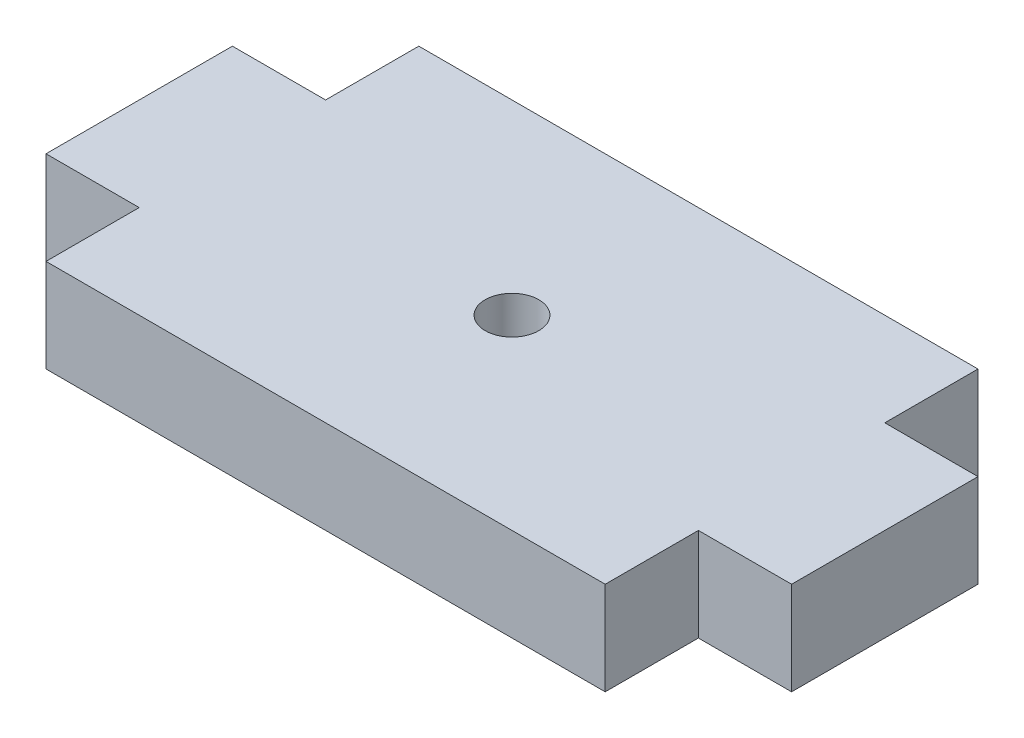
ISO-10303-21;
HEADER;
FILE_DESCRIPTION(('STEP AP214'),'2;1');
FILE_NAME('part.step','',(''),(''),'','','');
FILE_SCHEMA(('AUTOMOTIVE_DESIGN { 1 0 10303 214 1 1 1 1 }'));
ENDSEC;
DATA;
#1=APPLICATION_CONTEXT('core data for automotive mechanical design processes');
#2=APPLICATION_PROTOCOL_DEFINITION('international standard','automotive_design',2000,#1);
#3=PRODUCT_CONTEXT('',#1,'mechanical');
#4=PRODUCT('Part','Part','',(#3));
#5=PRODUCT_RELATED_PRODUCT_CATEGORY('part','',(#4));
#6=PRODUCT_DEFINITION_FORMATION('','',#4);
#7=PRODUCT_DEFINITION_CONTEXT('part definition',#1,'design');
#8=PRODUCT_DEFINITION('design','',#6,#7);
#9=PRODUCT_DEFINITION_SHAPE('','',#8);
#10=(LENGTH_UNIT() NAMED_UNIT(*) SI_UNIT(.MILLI.,.METRE.));
#11=(NAMED_UNIT(*) PLANE_ANGLE_UNIT() SI_UNIT($,.RADIAN.));
#12=(NAMED_UNIT(*) SI_UNIT($,.STERADIAN.) SOLID_ANGLE_UNIT());
#13=UNCERTAINTY_MEASURE_WITH_UNIT(LENGTH_MEASURE(1.E-05),#10,'distance_accuracy_value','');
#14=(GEOMETRIC_REPRESENTATION_CONTEXT(3) GLOBAL_UNCERTAINTY_ASSIGNED_CONTEXT((#13)) GLOBAL_UNIT_ASSIGNED_CONTEXT((#10,
#11,#12)) REPRESENTATION_CONTEXT('',''));
#15=CARTESIAN_POINT('',(0.,0.,0.));
#16=DIRECTION('',(0.,0.,1.));
#17=DIRECTION('',(1.,0.,0.));
#18=AXIS2_PLACEMENT_3D('',#15,#16,#17);
#19=CARTESIAN_POINT('',(38.1,6.35,0.));
#20=DIRECTION('',(1.,0.,0.));
#21=DIRECTION('',(0.,0.,-1.));
#22=AXIS2_PLACEMENT_3D('',#19,#20,#21);
#23=PLANE('',#22);
#24=DIRECTION('',(0.,0.,1.));
#25=VECTOR('',#24,1.);
#26=CARTESIAN_POINT('',(38.1,0.,0.));
#27=LINE('',#26,#25);
#28=CARTESIAN_POINT('',(38.1,0.,0.));
#29=VERTEX_POINT('',#28);
#30=CARTESIAN_POINT('',(38.1,0.,6.35));
#31=VERTEX_POINT('',#30);
#32=EDGE_CURVE('E210',#29,#31,#27,.T.);
#33=ORIENTED_EDGE('',*,*,#32,.F.);
#34=DIRECTION('',(0.,-1.,0.));
#35=VECTOR('',#34,1.);
#36=CARTESIAN_POINT('',(38.1,6.35,0.));
#37=LINE('',#36,#35);
#38=CARTESIAN_POINT('',(38.1,6.35,0.));
#39=VERTEX_POINT('',#38);
#40=EDGE_CURVE('E11',#39,#29,#37,.T.);
#41=ORIENTED_EDGE('',*,*,#40,.F.);
#42=DIRECTION('',(0.,0.,1.));
#43=VECTOR('',#42,1.);
#44=CARTESIAN_POINT('',(38.1,6.35,0.));
#45=LINE('',#44,#43);
#46=CARTESIAN_POINT('',(38.1,6.35,6.35));
#47=VERTEX_POINT('',#46);
#48=EDGE_CURVE('E308',#39,#47,#45,.T.);
#49=ORIENTED_EDGE('',*,*,#48,.T.);
#50=DIRECTION('',(0.,-1.,0.));
#51=VECTOR('',#50,1.);
#52=CARTESIAN_POINT('',(38.1,6.35,6.35));
#53=LINE('',#52,#51);
#54=EDGE_CURVE('E59',#47,#31,#53,.T.);
#55=ORIENTED_EDGE('',*,*,#54,.T.);
#56=EDGE_LOOP('',(#33,#41,#49,#55));
#57=FACE_BOUND('',#56,.T.);
#58=ADVANCED_FACE('F41',(#57),#23,.T.);
#59=CARTESIAN_POINT('',(0.,6.35,0.));
#60=DIRECTION('',(0.,0.,-1.));
#61=DIRECTION('',(-1.,0.,0.));
#62=AXIS2_PLACEMENT_3D('',#59,#60,#61);
#63=PLANE('',#62);
#64=DIRECTION('',(1.,0.,0.));
#65=VECTOR('',#64,1.);
#66=CARTESIAN_POINT('',(0.,0.,0.));
#67=LINE('',#66,#65);
#68=CARTESIAN_POINT('',(0.,0.,0.));
#69=VERTEX_POINT('',#68);
#70=EDGE_CURVE('E202',#69,#29,#67,.T.);
#71=ORIENTED_EDGE('',*,*,#70,.F.);
#72=DIRECTION('',(0.,-1.,0.));
#73=VECTOR('',#72,1.);
#74=CARTESIAN_POINT('',(0.,6.35,0.));
#75=LINE('',#74,#73);
#76=CARTESIAN_POINT('',(0.,6.35,0.));
#77=VERTEX_POINT('',#76);
#78=EDGE_CURVE('E51',#77,#69,#75,.T.);
#79=ORIENTED_EDGE('',*,*,#78,.F.);
#80=DIRECTION('',(1.,0.,0.));
#81=VECTOR('',#80,1.);
#82=CARTESIAN_POINT('',(0.,6.35,0.));
#83=LINE('',#82,#81);
#84=EDGE_CURVE('E303',#77,#39,#83,.T.);
#85=ORIENTED_EDGE('',*,*,#84,.T.);
#86=ORIENTED_EDGE('',*,*,#40,.T.);
#87=EDGE_LOOP('',(#71,#79,#85,#86));
#88=FACE_BOUND('',#87,.T.);
#89=ADVANCED_FACE('F208',(#88),#63,.T.);
#90=CARTESIAN_POINT('',(0.,6.35,0.));
#91=DIRECTION('',(1.,0.,0.));
#92=DIRECTION('',(0.,0.,-1.));
#93=AXIS2_PLACEMENT_3D('',#90,#91,#92);
#94=PLANE('',#93);
#95=DIRECTION('',(0.,0.,1.));
#96=VECTOR('',#95,1.);
#97=CARTESIAN_POINT('',(0.,0.,0.));
#98=LINE('',#97,#96);
#99=CARTESIAN_POINT('',(0.,0.,6.35));
#100=VERTEX_POINT('',#99);
#101=EDGE_CURVE('E192',#69,#100,#98,.T.);
#102=ORIENTED_EDGE('',*,*,#101,.T.);
#103=DIRECTION('',(0.,-1.,0.));
#104=VECTOR('',#103,1.);
#105=CARTESIAN_POINT('',(0.,6.35,6.35));
#106=LINE('',#105,#104);
#107=CARTESIAN_POINT('',(0.,6.35,6.35));
#108=VERTEX_POINT('',#107);
#109=EDGE_CURVE('E182',#108,#100,#106,.T.);
#110=ORIENTED_EDGE('',*,*,#109,.F.);
#111=DIRECTION('',(0.,0.,1.));
#112=VECTOR('',#111,1.);
#113=CARTESIAN_POINT('',(0.,6.35,0.));
#114=LINE('',#113,#112);
#115=EDGE_CURVE('E194',#77,#108,#114,.T.);
#116=ORIENTED_EDGE('',*,*,#115,.F.);
#117=ORIENTED_EDGE('',*,*,#78,.T.);
#118=EDGE_LOOP('',(#102,#110,#116,#117));
#119=FACE_BOUND('',#118,.T.);
#120=ADVANCED_FACE('F190',(#119),#94,.F.);
#121=CARTESIAN_POINT('',(0.,6.35,6.35));
#122=DIRECTION('',(0.,0.,1.));
#123=DIRECTION('',(1.,0.,0.));
#124=AXIS2_PLACEMENT_3D('',#121,#122,#123);
#125=PLANE('',#124);
#126=DIRECTION('',(-1.,0.,0.));
#127=VECTOR('',#126,1.);
#128=CARTESIAN_POINT('',(0.,0.,6.35));
#129=LINE('',#128,#127);
#130=CARTESIAN_POINT('',(-6.35,0.,6.35));
#131=VERTEX_POINT('',#130);
#132=EDGE_CURVE('E204',#100,#131,#129,.T.);
#133=ORIENTED_EDGE('',*,*,#132,.T.);
#134=DIRECTION('',(0.,-1.,0.));
#135=VECTOR('',#134,1.);
#136=CARTESIAN_POINT('',(-6.35,6.35,6.35));
#137=LINE('',#136,#135);
#138=CARTESIAN_POINT('',(-6.35,6.35,6.35));
#139=VERTEX_POINT('',#138);
#140=EDGE_CURVE('E178',#139,#131,#137,.T.);
#141=ORIENTED_EDGE('',*,*,#140,.F.);
#142=DIRECTION('',(-1.,0.,0.));
#143=VECTOR('',#142,1.);
#144=CARTESIAN_POINT('',(0.,6.35,6.35));
#145=LINE('',#144,#143);
#146=EDGE_CURVE('E300',#108,#139,#145,.T.);
#147=ORIENTED_EDGE('',*,*,#146,.F.);
#148=ORIENTED_EDGE('',*,*,#109,.T.);
#149=EDGE_LOOP('',(#133,#141,#147,#148));
#150=FACE_BOUND('',#149,.T.);
#151=ADVANCED_FACE('F299',(#150),#125,.F.);
#152=CARTESIAN_POINT('',(-6.35,6.35,0.));
#153=DIRECTION('',(1.,0.,0.));
#154=DIRECTION('',(0.,0.,-1.));
#155=AXIS2_PLACEMENT_3D('',#152,#153,#154);
#156=PLANE('',#155);
#157=DIRECTION('',(0.,0.,1.));
#158=VECTOR('',#157,1.);
#159=CARTESIAN_POINT('',(-6.35,0.,0.));
#160=LINE('',#159,#158);
#161=CARTESIAN_POINT('',(-6.35,0.,19.05));
#162=VERTEX_POINT('',#161);
#163=EDGE_CURVE('E220',#131,#162,#160,.T.);
#164=ORIENTED_EDGE('',*,*,#163,.T.);
#165=DIRECTION('',(0.,-1.,0.));
#166=VECTOR('',#165,1.);
#167=CARTESIAN_POINT('',(-6.35,6.35,19.05));
#168=LINE('',#167,#166);
#169=CARTESIAN_POINT('',(-6.35,6.35,19.05));
#170=VERTEX_POINT('',#169);
#171=EDGE_CURVE('E175',#170,#162,#168,.T.);
#172=ORIENTED_EDGE('',*,*,#171,.F.);
#173=DIRECTION('',(0.,0.,1.));
#174=VECTOR('',#173,1.);
#175=CARTESIAN_POINT('',(-6.35,6.35,0.));
#176=LINE('',#175,#174);
#177=EDGE_CURVE('E296',#139,#170,#176,.T.);
#178=ORIENTED_EDGE('',*,*,#177,.F.);
#179=ORIENTED_EDGE('',*,*,#140,.T.);
#180=EDGE_LOOP('',(#164,#172,#178,#179));
#181=FACE_BOUND('',#180,.T.);
#182=ADVANCED_FACE('F294',(#181),#156,.F.);
#183=CARTESIAN_POINT('',(0.,6.35,19.05));
#184=DIRECTION('',(0.,0.,1.));
#185=DIRECTION('',(1.,0.,0.));
#186=AXIS2_PLACEMENT_3D('',#183,#184,#185);
#187=PLANE('',#186);
#188=DIRECTION('',(-1.,0.,0.));
#189=VECTOR('',#188,1.);
#190=CARTESIAN_POINT('',(0.,0.,19.05));
#191=LINE('',#190,#189);
#192=CARTESIAN_POINT('',(0.,0.,19.05));
#193=VERTEX_POINT('',#192);
#194=EDGE_CURVE('E224',#193,#162,#191,.T.);
#195=ORIENTED_EDGE('',*,*,#194,.F.);
#196=DIRECTION('',(0.,-1.,0.));
#197=VECTOR('',#196,1.);
#198=CARTESIAN_POINT('',(0.,6.35,19.05));
#199=LINE('',#198,#197);
#200=CARTESIAN_POINT('',(0.,6.35,19.05));
#201=VERTEX_POINT('',#200);
#202=EDGE_CURVE('E172',#201,#193,#199,.T.);
#203=ORIENTED_EDGE('',*,*,#202,.F.);
#204=DIRECTION('',(-1.,0.,0.));
#205=VECTOR('',#204,1.);
#206=CARTESIAN_POINT('',(0.,6.35,19.05));
#207=LINE('',#206,#205);
#208=EDGE_CURVE('E292',#201,#170,#207,.T.);
#209=ORIENTED_EDGE('',*,*,#208,.T.);
#210=ORIENTED_EDGE('',*,*,#171,.T.);
#211=EDGE_LOOP('',(#195,#203,#209,#210));
#212=FACE_BOUND('',#211,.T.);
#213=ADVANCED_FACE('F288',(#212),#187,.T.);
#214=CARTESIAN_POINT('',(0.,0.,25.4));
#215=VERTEX_POINT('',#214);
#216=EDGE_CURVE('E207',#193,#215,#98,.T.);
#217=ORIENTED_EDGE('',*,*,#216,.T.);
#218=DIRECTION('',(0.,-1.,0.));
#219=VECTOR('',#218,1.);
#220=CARTESIAN_POINT('',(0.,6.35,25.4));
#221=LINE('',#220,#219);
#222=CARTESIAN_POINT('',(0.,6.35,25.4));
#223=VERTEX_POINT('',#222);
#224=EDGE_CURVE('E168',#223,#215,#221,.T.);
#225=ORIENTED_EDGE('',*,*,#224,.F.);
#226=EDGE_CURVE('E306',#201,#223,#114,.T.);
#227=ORIENTED_EDGE('',*,*,#226,.F.);
#228=ORIENTED_EDGE('',*,*,#202,.T.);
#229=EDGE_LOOP('',(#217,#225,#227,#228));
#230=FACE_BOUND('',#229,.T.);
#231=ADVANCED_FACE('F274',(#230),#94,.F.);
#232=CARTESIAN_POINT('',(0.,6.35,25.4));
#233=DIRECTION('',(0.,0.,-1.));
#234=DIRECTION('',(-1.,0.,0.));
#235=AXIS2_PLACEMENT_3D('',#232,#233,#234);
#236=PLANE('',#235);
#237=DIRECTION('',(1.,0.,0.));
#238=VECTOR('',#237,1.);
#239=CARTESIAN_POINT('',(0.,0.,25.4));
#240=LINE('',#239,#238);
#241=CARTESIAN_POINT('',(38.1,0.,25.4));
#242=VERTEX_POINT('',#241);
#243=EDGE_CURVE('E228',#215,#242,#240,.T.);
#244=ORIENTED_EDGE('',*,*,#243,.T.);
#245=DIRECTION('',(0.,-1.,0.));
#246=VECTOR('',#245,1.);
#247=CARTESIAN_POINT('',(38.1,6.35,25.4));
#248=LINE('',#247,#246);
#249=CARTESIAN_POINT('',(38.1,6.35,25.4));
#250=VERTEX_POINT('',#249);
#251=EDGE_CURVE('E161',#250,#242,#248,.T.);
#252=ORIENTED_EDGE('',*,*,#251,.F.);
#253=DIRECTION('',(1.,0.,0.));
#254=VECTOR('',#253,1.);
#255=CARTESIAN_POINT('',(0.,6.35,25.4));
#256=LINE('',#255,#254);
#257=EDGE_CURVE('E312',#223,#250,#256,.T.);
#258=ORIENTED_EDGE('',*,*,#257,.F.);
#259=ORIENTED_EDGE('',*,*,#224,.T.);
#260=EDGE_LOOP('',(#244,#252,#258,#259));
#261=FACE_BOUND('',#260,.T.);
#262=ADVANCED_FACE('F268',(#261),#236,.F.);
#263=CARTESIAN_POINT('',(38.1,0.,19.05));
#264=VERTEX_POINT('',#263);
#265=EDGE_CURVE('E215',#264,#242,#27,.T.);
#266=ORIENTED_EDGE('',*,*,#265,.F.);
#267=DIRECTION('',(0.,-1.,0.));
#268=VECTOR('',#267,1.);
#269=CARTESIAN_POINT('',(38.1,6.35,19.05));
#270=LINE('',#269,#268);
#271=CARTESIAN_POINT('',(38.1,6.35,19.05));
#272=VERTEX_POINT('',#271);
#273=EDGE_CURVE('E157',#272,#264,#270,.T.);
#274=ORIENTED_EDGE('',*,*,#273,.F.);
#275=EDGE_CURVE('E149',#272,#250,#45,.T.);
#276=ORIENTED_EDGE('',*,*,#275,.T.);
#277=ORIENTED_EDGE('',*,*,#251,.T.);
#278=EDGE_LOOP('',(#266,#274,#276,#277));
#279=FACE_BOUND('',#278,.T.);
#280=ADVANCED_FACE('F261',(#279),#23,.T.);
#281=CARTESIAN_POINT('',(0.,6.35,19.05));
#282=DIRECTION('',(0.,0.,-1.));
#283=DIRECTION('',(-1.,0.,0.));
#284=AXIS2_PLACEMENT_3D('',#281,#282,#283);
#285=PLANE('',#284);
#286=DIRECTION('',(1.,0.,0.));
#287=VECTOR('',#286,1.);
#288=CARTESIAN_POINT('',(0.,0.,19.05));
#289=LINE('',#288,#287);
#290=CARTESIAN_POINT('',(44.45,0.,19.05));
#291=VERTEX_POINT('',#290);
#292=EDGE_CURVE('E155',#264,#291,#289,.T.);
#293=ORIENTED_EDGE('',*,*,#292,.T.);
#294=DIRECTION('',(0.,-1.,0.));
#295=VECTOR('',#294,1.);
#296=CARTESIAN_POINT('',(44.45,6.35,19.05));
#297=LINE('',#296,#295);
#298=CARTESIAN_POINT('',(44.45,6.35,19.05));
#299=VERTEX_POINT('',#298);
#300=EDGE_CURVE('E137',#299,#291,#297,.T.);
#301=ORIENTED_EDGE('',*,*,#300,.F.);
#302=DIRECTION('',(1.,0.,0.));
#303=VECTOR('',#302,1.);
#304=CARTESIAN_POINT('',(0.,6.35,19.05));
#305=LINE('',#304,#303);
#306=EDGE_CURVE('E143',#272,#299,#305,.T.);
#307=ORIENTED_EDGE('',*,*,#306,.F.);
#308=ORIENTED_EDGE('',*,*,#273,.T.);
#309=EDGE_LOOP('',(#293,#301,#307,#308));
#310=FACE_BOUND('',#309,.T.);
#311=ADVANCED_FACE('F153',(#310),#285,.F.);
#312=CARTESIAN_POINT('',(44.45,6.35,0.));
#313=DIRECTION('',(-1.,0.,0.));
#314=DIRECTION('',(0.,0.,1.));
#315=AXIS2_PLACEMENT_3D('',#312,#313,#314);
#316=PLANE('',#315);
#317=DIRECTION('',(0.,0.,-1.));
#318=VECTOR('',#317,1.);
#319=CARTESIAN_POINT('',(44.45,0.,0.));
#320=LINE('',#319,#318);
#321=CARTESIAN_POINT('',(44.45,0.,6.35));
#322=VERTEX_POINT('',#321);
#323=EDGE_CURVE('E234',#291,#322,#320,.T.);
#324=ORIENTED_EDGE('',*,*,#323,.T.);
#325=DIRECTION('',(0.,-1.,0.));
#326=VECTOR('',#325,1.);
#327=CARTESIAN_POINT('',(44.45,6.35,6.35));
#328=LINE('',#327,#326);
#329=CARTESIAN_POINT('',(44.45,6.35,6.35));
#330=VERTEX_POINT('',#329);
#331=EDGE_CURVE('E97',#330,#322,#328,.T.);
#332=ORIENTED_EDGE('',*,*,#331,.F.);
#333=DIRECTION('',(0.,0.,-1.));
#334=VECTOR('',#333,1.);
#335=CARTESIAN_POINT('',(44.45,6.35,0.));
#336=LINE('',#335,#334);
#337=EDGE_CURVE('E133',#299,#330,#336,.T.);
#338=ORIENTED_EDGE('',*,*,#337,.F.);
#339=ORIENTED_EDGE('',*,*,#300,.T.);
#340=EDGE_LOOP('',(#324,#332,#338,#339));
#341=FACE_BOUND('',#340,.T.);
#342=ADVANCED_FACE('F135',(#341),#316,.F.);
#343=CARTESIAN_POINT('',(19.05,6.35,12.7));
#344=DIRECTION('',(0.,-1.,0.));
#345=DIRECTION('',(0.,0.,-1.));
#346=AXIS2_PLACEMENT_3D('',#343,#344,#345);
#347=CYLINDRICAL_SURFACE('',#346,1.8288);
#348=CARTESIAN_POINT('',(19.05,6.35,12.7));
#349=DIRECTION('',(0.,1.,0.));
#350=DIRECTION('',(0.,0.,1.));
#351=AXIS2_PLACEMENT_3D('',#348,#349,#350);
#352=CIRCLE('',#351,1.8288);
#353=CARTESIAN_POINT('',(19.05,6.35,14.5288));
#354=VERTEX_POINT('',#353);
#355=EDGE_CURVE('E240',#354,#354,#352,.T.);
#356=ORIENTED_EDGE('',*,*,#355,.T.);
#357=EDGE_LOOP('',(#356));
#358=FACE_BOUND('',#357,.T.);
#359=CARTESIAN_POINT('',(19.05,0.,12.7));
#360=DIRECTION('',(0.,1.,0.));
#361=DIRECTION('',(0.,0.,1.));
#362=AXIS2_PLACEMENT_3D('',#359,#360,#361);
#363=CIRCLE('',#362,1.8288);
#364=CARTESIAN_POINT('',(19.05,0.,14.5288));
#365=VERTEX_POINT('',#364);
#366=EDGE_CURVE('E213',#365,#365,#363,.T.);
#367=ORIENTED_EDGE('',*,*,#366,.F.);
#368=EDGE_LOOP('',(#367));
#369=FACE_BOUND('',#368,.T.);
#370=ADVANCED_FACE('F43',(#358,#369),#347,.F.);
#371=CARTESIAN_POINT('',(0.,6.35,6.35));
#372=DIRECTION('',(0.,0.,-1.));
#373=DIRECTION('',(-1.,0.,0.));
#374=AXIS2_PLACEMENT_3D('',#371,#372,#373);
#375=PLANE('',#374);
#376=DIRECTION('',(1.,0.,0.));
#377=VECTOR('',#376,1.);
#378=CARTESIAN_POINT('',(0.,0.,6.35));
#379=LINE('',#378,#377);
#380=EDGE_CURVE('E237',#31,#322,#379,.T.);
#381=ORIENTED_EDGE('',*,*,#380,.F.);
#382=ORIENTED_EDGE('',*,*,#54,.F.);
#383=DIRECTION('',(1.,0.,0.));
#384=VECTOR('',#383,1.);
#385=CARTESIAN_POINT('',(0.,6.35,6.35));
#386=LINE('',#385,#384);
#387=EDGE_CURVE('E142',#47,#330,#386,.T.);
#388=ORIENTED_EDGE('',*,*,#387,.T.);
#389=ORIENTED_EDGE('',*,*,#331,.T.);
#390=EDGE_LOOP('',(#381,#382,#388,#389));
#391=FACE_BOUND('',#390,.T.);
#392=ADVANCED_FACE('F250',(#391),#375,.T.);
#393=CARTESIAN_POINT('',(0.,6.35,0.));
#394=DIRECTION('',(0.,1.,0.));
#395=DIRECTION('',(0.,0.,1.));
#396=AXIS2_PLACEMENT_3D('',#393,#394,#395);
#397=PLANE('',#396);
#398=ORIENTED_EDGE('',*,*,#355,.F.);
#399=EDGE_LOOP('',(#398));
#400=FACE_BOUND('',#399,.T.);
#401=ORIENTED_EDGE('',*,*,#48,.F.);
#402=ORIENTED_EDGE('',*,*,#84,.F.);
#403=ORIENTED_EDGE('',*,*,#115,.T.);
#404=ORIENTED_EDGE('',*,*,#146,.T.);
#405=ORIENTED_EDGE('',*,*,#177,.T.);
#406=ORIENTED_EDGE('',*,*,#208,.F.);
#407=ORIENTED_EDGE('',*,*,#226,.T.);
#408=ORIENTED_EDGE('',*,*,#257,.T.);
#409=ORIENTED_EDGE('',*,*,#275,.F.);
#410=ORIENTED_EDGE('',*,*,#306,.T.);
#411=ORIENTED_EDGE('',*,*,#337,.T.);
#412=ORIENTED_EDGE('',*,*,#387,.F.);
#413=EDGE_LOOP('',(#401,#402,#403,#404,#405,#406,#407,#408,#409,#410,#411,#412));
#414=FACE_BOUND('',#413,.T.);
#415=ADVANCED_FACE('F147',(#400,#414),#397,.T.);
#416=CARTESIAN_POINT('',(0.,0.,0.));
#417=DIRECTION('',(0.,1.,0.));
#418=DIRECTION('',(0.,0.,1.));
#419=AXIS2_PLACEMENT_3D('',#416,#417,#418);
#420=PLANE('',#419);
#421=ORIENTED_EDGE('',*,*,#366,.T.);
#422=EDGE_LOOP('',(#421));
#423=FACE_BOUND('',#422,.T.);
#424=ORIENTED_EDGE('',*,*,#32,.T.);
#425=ORIENTED_EDGE('',*,*,#380,.T.);
#426=ORIENTED_EDGE('',*,*,#323,.F.);
#427=ORIENTED_EDGE('',*,*,#292,.F.);
#428=ORIENTED_EDGE('',*,*,#265,.T.);
#429=ORIENTED_EDGE('',*,*,#243,.F.);
#430=ORIENTED_EDGE('',*,*,#216,.F.);
#431=ORIENTED_EDGE('',*,*,#194,.T.);
#432=ORIENTED_EDGE('',*,*,#163,.F.);
#433=ORIENTED_EDGE('',*,*,#132,.F.);
#434=ORIENTED_EDGE('',*,*,#101,.F.);
#435=ORIENTED_EDGE('',*,*,#70,.T.);
#436=EDGE_LOOP('',(#424,#425,#426,#427,#428,#429,#430,#431,#432,#433,#434,#435));
#437=FACE_BOUND('',#436,.T.);
#438=ADVANCED_FACE('F201',(#423,#437),#420,.F.);
#439=CLOSED_SHELL('',(#58,#89,#120,#151,#182,#213,#231,#262,#280,#311,#342,#370,#392,#415,#438));
#440=MANIFOLD_SOLID_BREP('B2',#439);
#441=ADVANCED_BREP_SHAPE_REPRESENTATION('',(#18,#440),#14);
#442=SHAPE_DEFINITION_REPRESENTATION(#9,#441);
ENDSEC;
END-ISO-10303-21;
